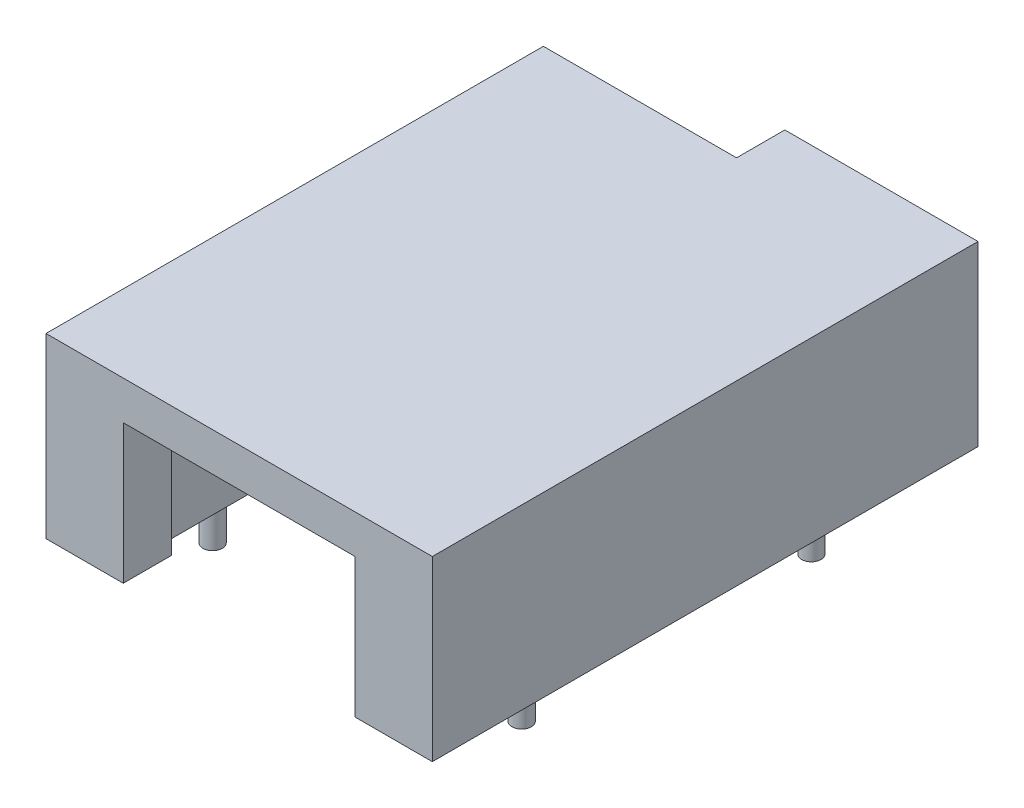
ISO-10303-21;
HEADER;
FILE_DESCRIPTION(('STEP AP214'),'2;1');
FILE_NAME('part.step','',(''),(''),'','','');
FILE_SCHEMA(('AUTOMOTIVE_DESIGN { 1 0 10303 214 1 1 1 1 }'));
ENDSEC;
DATA;
#1=APPLICATION_CONTEXT('core data for automotive mechanical design processes');
#2=APPLICATION_PROTOCOL_DEFINITION('international standard','automotive_design',2000,#1);
#3=PRODUCT_CONTEXT('',#1,'mechanical');
#4=PRODUCT('Part','Part','',(#3));
#5=PRODUCT_RELATED_PRODUCT_CATEGORY('part','',(#4));
#6=PRODUCT_DEFINITION_FORMATION('','',#4);
#7=PRODUCT_DEFINITION_CONTEXT('part definition',#1,'design');
#8=PRODUCT_DEFINITION('design','',#6,#7);
#9=PRODUCT_DEFINITION_SHAPE('','',#8);
#10=(LENGTH_UNIT() NAMED_UNIT(*) SI_UNIT(.MILLI.,.METRE.));
#11=(NAMED_UNIT(*) PLANE_ANGLE_UNIT() SI_UNIT($,.RADIAN.));
#12=(NAMED_UNIT(*) SI_UNIT($,.STERADIAN.) SOLID_ANGLE_UNIT());
#13=UNCERTAINTY_MEASURE_WITH_UNIT(LENGTH_MEASURE(1.E-05),#10,'distance_accuracy_value','');
#14=(GEOMETRIC_REPRESENTATION_CONTEXT(3) GLOBAL_UNCERTAINTY_ASSIGNED_CONTEXT((#13)) GLOBAL_UNIT_ASSIGNED_CONTEXT((#10,
#11,#12)) REPRESENTATION_CONTEXT('',''));
#15=CARTESIAN_POINT('',(0.,0.,0.));
#16=DIRECTION('',(0.,0.,1.));
#17=DIRECTION('',(1.,0.,0.));
#18=AXIS2_PLACEMENT_3D('',#15,#16,#17);
#19=CARTESIAN_POINT('',(0.,0.,0.));
#20=DIRECTION('',(0.,0.,-1.));
#21=DIRECTION('',(-1.,0.,0.));
#22=AXIS2_PLACEMENT_3D('',#19,#20,#21);
#23=PLANE('',#22);
#24=DIRECTION('',(-1.,0.,0.));
#25=VECTOR('',#24,1.);
#26=CARTESIAN_POINT('',(0.,18.4,0.));
#27=LINE('',#26,#25);
#28=CARTESIAN_POINT('',(20.,18.4,0.));
#29=VERTEX_POINT('',#28);
#30=CARTESIAN_POINT('',(0.,18.4,0.));
#31=VERTEX_POINT('',#30);
#32=EDGE_CURVE('E255',#29,#31,#27,.T.);
#33=ORIENTED_EDGE('',*,*,#32,.F.);
#34=DIRECTION('',(0.,-1.,0.));
#35=VECTOR('',#34,1.);
#36=CARTESIAN_POINT('',(20.,0.,0.));
#37=LINE('',#36,#35);
#38=CARTESIAN_POINT('',(20.,14.4,0.));
#39=VERTEX_POINT('',#38);
#40=EDGE_CURVE('E151',#29,#39,#37,.T.);
#41=ORIENTED_EDGE('',*,*,#40,.T.);
#42=DIRECTION('',(-1.,0.,0.));
#43=VECTOR('',#42,1.);
#44=CARTESIAN_POINT('',(6.5,14.4,0.));
#45=LINE('',#44,#43);
#46=CARTESIAN_POINT('',(6.5,14.4,0.));
#47=VERTEX_POINT('',#46);
#48=EDGE_CURVE('E228',#39,#47,#45,.T.);
#49=ORIENTED_EDGE('',*,*,#48,.T.);
#50=DIRECTION('',(0.,-1.,0.));
#51=VECTOR('',#50,1.);
#52=CARTESIAN_POINT('',(6.5,0.,0.));
#53=LINE('',#52,#51);
#54=CARTESIAN_POINT('',(6.5,0.,0.));
#55=VERTEX_POINT('',#54);
#56=EDGE_CURVE('E223',#47,#55,#53,.T.);
#57=ORIENTED_EDGE('',*,*,#56,.T.);
#58=DIRECTION('',(1.,0.,0.));
#59=VECTOR('',#58,1.);
#60=CARTESIAN_POINT('',(0.,0.,0.));
#61=LINE('',#60,#59);
#62=CARTESIAN_POINT('',(0.,0.,0.));
#63=VERTEX_POINT('',#62);
#64=EDGE_CURVE('E252',#63,#55,#61,.T.);
#65=ORIENTED_EDGE('',*,*,#64,.F.);
#66=DIRECTION('',(0.,-1.,0.));
#67=VECTOR('',#66,1.);
#68=CARTESIAN_POINT('',(0.,0.,0.));
#69=LINE('',#68,#67);
#70=EDGE_CURVE('E249',#31,#63,#69,.T.);
#71=ORIENTED_EDGE('',*,*,#70,.F.);
#72=EDGE_LOOP('',(#33,#41,#49,#57,#65,#71));
#73=FACE_BOUND('',#72,.T.);
#74=ADVANCED_FACE('F39',(#73),#23,.T.);
#75=CARTESIAN_POINT('',(0.,0.,46.5));
#76=DIRECTION('',(0.,1.,0.));
#77=DIRECTION('',(0.,0.,1.));
#78=AXIS2_PLACEMENT_3D('',#75,#76,#77);
#79=PLANE('',#78);
#80=CARTESIAN_POINT('',(3.99999999999999,0.,8.25));
#81=DIRECTION('',(0.,1.,0.));
#82=DIRECTION('',(0.,0.,1.));
#83=AXIS2_PLACEMENT_3D('',#80,#81,#82);
#84=CIRCLE('',#83,0.999999999999998);
#85=CARTESIAN_POINT('',(3.99999999999999,0.,9.25));
#86=VERTEX_POINT('',#85);
#87=EDGE_CURVE('E47',#86,#86,#84,.F.);
#88=ORIENTED_EDGE('',*,*,#87,.F.);
#89=EDGE_LOOP('',(#88));
#90=FACE_BOUND('',#89,.T.);
#91=CARTESIAN_POINT('',(3.99999999999999,0.,38.25));
#92=DIRECTION('',(0.,1.,0.));
#93=DIRECTION('',(0.,0.,1.));
#94=AXIS2_PLACEMENT_3D('',#91,#92,#93);
#95=CIRCLE('',#94,0.999999999999998);
#96=CARTESIAN_POINT('',(3.99999999999999,0.,39.25));
#97=VERTEX_POINT('',#96);
#98=EDGE_CURVE('E269',#97,#97,#95,.F.);
#99=ORIENTED_EDGE('',*,*,#98,.F.);
#100=EDGE_LOOP('',(#99));
#101=FACE_BOUND('',#100,.T.);
#102=ORIENTED_EDGE('',*,*,#64,.T.);
#103=DIRECTION('',(0.,0.,1.));
#104=VECTOR('',#103,1.);
#105=CARTESIAN_POINT('',(6.5,0.,0.));
#106=LINE('',#105,#104);
#107=CARTESIAN_POINT('',(6.5,0.,46.5));
#108=VERTEX_POINT('',#107);
#109=EDGE_CURVE('E231',#55,#108,#106,.T.);
#110=ORIENTED_EDGE('',*,*,#109,.T.);
#111=DIRECTION('',(1.,0.,0.));
#112=VECTOR('',#111,1.);
#113=CARTESIAN_POINT('',(0.,0.,46.5));
#114=LINE('',#113,#112);
#115=CARTESIAN_POINT('',(8.,0.,46.5));
#116=VERTEX_POINT('',#115);
#117=EDGE_CURVE('E154',#108,#116,#114,.T.);
#118=ORIENTED_EDGE('',*,*,#117,.T.);
#119=DIRECTION('',(0.,0.,-1.));
#120=VECTOR('',#119,1.);
#121=CARTESIAN_POINT('',(8.,0.,51.5));
#122=LINE('',#121,#120);
#123=CARTESIAN_POINT('',(8.,0.,51.5));
#124=VERTEX_POINT('',#123);
#125=EDGE_CURVE('E220',#124,#116,#122,.T.);
#126=ORIENTED_EDGE('',*,*,#125,.F.);
#127=DIRECTION('',(1.,0.,0.));
#128=VECTOR('',#127,1.);
#129=CARTESIAN_POINT('',(0.,0.,51.5));
#130=LINE('',#129,#128);
#131=CARTESIAN_POINT('',(0.,0.,51.5));
#132=VERTEX_POINT('',#131);
#133=EDGE_CURVE('E185',#132,#124,#130,.T.);
#134=ORIENTED_EDGE('',*,*,#133,.F.);
#135=DIRECTION('',(0.,0.,-1.));
#136=VECTOR('',#135,1.);
#137=CARTESIAN_POINT('',(0.,0.,46.5));
#138=LINE('',#137,#136);
#139=EDGE_CURVE('E263',#132,#63,#138,.T.);
#140=ORIENTED_EDGE('',*,*,#139,.T.);
#141=EDGE_LOOP('',(#102,#110,#118,#126,#134,#140));
#142=FACE_BOUND('',#141,.T.);
#143=ADVANCED_FACE('F276',(#90,#101,#142),#79,.F.);
#144=CARTESIAN_POINT('',(0.,0.,46.5));
#145=DIRECTION('',(1.,0.,0.));
#146=DIRECTION('',(0.,0.,-1.));
#147=AXIS2_PLACEMENT_3D('',#144,#145,#146);
#148=PLANE('',#147);
#149=ORIENTED_EDGE('',*,*,#70,.T.);
#150=ORIENTED_EDGE('',*,*,#139,.F.);
#151=DIRECTION('',(0.,-1.,0.));
#152=VECTOR('',#151,1.);
#153=CARTESIAN_POINT('',(0.,0.,51.5));
#154=LINE('',#153,#152);
#155=CARTESIAN_POINT('',(0.,18.4,51.5));
#156=VERTEX_POINT('',#155);
#157=EDGE_CURVE('E182',#156,#132,#154,.T.);
#158=ORIENTED_EDGE('',*,*,#157,.F.);
#159=DIRECTION('',(0.,0.,-1.));
#160=VECTOR('',#159,1.);
#161=CARTESIAN_POINT('',(0.,18.4,46.5));
#162=LINE('',#161,#160);
#163=EDGE_CURVE('E257',#156,#31,#162,.T.);
#164=ORIENTED_EDGE('',*,*,#163,.T.);
#165=EDGE_LOOP('',(#149,#150,#158,#164));
#166=FACE_BOUND('',#165,.T.);
#167=ADVANCED_FACE('F41',(#166),#148,.F.);
#168=CARTESIAN_POINT('',(36.,0.,8.25));
#169=DIRECTION('',(0.,1.,0.));
#170=DIRECTION('',(0.,0.,1.));
#171=AXIS2_PLACEMENT_3D('',#168,#169,#170);
#172=CIRCLE('',#171,0.999999999999998);
#173=CARTESIAN_POINT('',(36.,0.,9.25));
#174=VERTEX_POINT('',#173);
#175=EDGE_CURVE('E11',#174,#174,#172,.F.);
#176=ORIENTED_EDGE('',*,*,#175,.F.);
#177=EDGE_LOOP('',(#176));
#178=FACE_BOUND('',#177,.T.);
#179=CARTESIAN_POINT('',(36.,0.,38.25));
#180=DIRECTION('',(0.,1.,0.));
#181=DIRECTION('',(0.,0.,1.));
#182=AXIS2_PLACEMENT_3D('',#179,#180,#181);
#183=CIRCLE('',#182,0.999999999999998);
#184=CARTESIAN_POINT('',(36.,0.,39.25));
#185=VERTEX_POINT('',#184);
#186=EDGE_CURVE('E266',#185,#185,#183,.F.);
#187=ORIENTED_EDGE('',*,*,#186,.F.);
#188=EDGE_LOOP('',(#187));
#189=FACE_BOUND('',#188,.T.);
#190=DIRECTION('',(0.,0.,-1.));
#191=VECTOR('',#190,1.);
#192=CARTESIAN_POINT('',(40.,0.,46.5));
#193=LINE('',#192,#191);
#194=CARTESIAN_POINT('',(40.,0.,51.5));
#195=VERTEX_POINT('',#194);
#196=CARTESIAN_POINT('',(40.,0.,-5.));
#197=VERTEX_POINT('',#196);
#198=EDGE_CURVE('E261',#195,#197,#193,.T.);
#199=ORIENTED_EDGE('',*,*,#198,.F.);
#200=DIRECTION('',(1.,0.,0.));
#201=VECTOR('',#200,1.);
#202=CARTESIAN_POINT('',(0.,0.,51.5));
#203=LINE('',#202,#201);
#204=CARTESIAN_POINT('',(32.,1.09728353203603E-13,51.5));
#205=VERTEX_POINT('',#204);
#206=EDGE_CURVE('E195',#205,#195,#203,.T.);
#207=ORIENTED_EDGE('',*,*,#206,.F.);
#208=DIRECTION('',(0.,0.,-1.));
#209=VECTOR('',#208,1.);
#210=CARTESIAN_POINT('',(32.,1.09728353203603E-13,51.5));
#211=LINE('',#210,#209);
#212=CARTESIAN_POINT('',(32.,1.09728353203603E-13,46.5));
#213=VERTEX_POINT('',#212);
#214=EDGE_CURVE('E204',#205,#213,#211,.T.);
#215=ORIENTED_EDGE('',*,*,#214,.T.);
#216=DIRECTION('',(1.,0.,0.));
#217=VECTOR('',#216,1.);
#218=CARTESIAN_POINT('',(0.,0.,46.5));
#219=LINE('',#218,#217);
#220=CARTESIAN_POINT('',(33.5,0.,46.5));
#221=VERTEX_POINT('',#220);
#222=EDGE_CURVE('E186',#213,#221,#219,.T.);
#223=ORIENTED_EDGE('',*,*,#222,.T.);
#224=DIRECTION('',(0.,0.,1.));
#225=VECTOR('',#224,1.);
#226=CARTESIAN_POINT('',(33.5,0.,0.));
#227=LINE('',#226,#225);
#228=CARTESIAN_POINT('',(33.5,0.,0.));
#229=VERTEX_POINT('',#228);
#230=EDGE_CURVE('E238',#229,#221,#227,.T.);
#231=ORIENTED_EDGE('',*,*,#230,.F.);
#232=DIRECTION('',(-1.,0.,0.));
#233=VECTOR('',#232,1.);
#234=CARTESIAN_POINT('',(0.,0.,0.));
#235=LINE('',#234,#233);
#236=CARTESIAN_POINT('',(20.,0.,0.));
#237=VERTEX_POINT('',#236);
#238=EDGE_CURVE('E171',#229,#237,#235,.T.);
#239=ORIENTED_EDGE('',*,*,#238,.T.);
#240=DIRECTION('',(0.,0.,1.));
#241=VECTOR('',#240,1.);
#242=CARTESIAN_POINT('',(20.,0.,-5.));
#243=LINE('',#242,#241);
#244=CARTESIAN_POINT('',(20.,0.,-5.));
#245=VERTEX_POINT('',#244);
#246=EDGE_CURVE('E155',#245,#237,#243,.T.);
#247=ORIENTED_EDGE('',*,*,#246,.F.);
#248=DIRECTION('',(-1.,0.,0.));
#249=VECTOR('',#248,1.);
#250=CARTESIAN_POINT('',(0.,0.,-5.));
#251=LINE('',#250,#249);
#252=EDGE_CURVE('E169',#197,#245,#251,.T.);
#253=ORIENTED_EDGE('',*,*,#252,.F.);
#254=EDGE_LOOP('',(#199,#207,#215,#223,#231,#239,#247,#253));
#255=FACE_BOUND('',#254,.T.);
#256=ADVANCED_FACE('F279',(#178,#189,#255),#79,.F.);
#257=CARTESIAN_POINT('',(40.,0.,46.5));
#258=DIRECTION('',(-1.,0.,0.));
#259=DIRECTION('',(0.,0.,1.));
#260=AXIS2_PLACEMENT_3D('',#257,#258,#259);
#261=PLANE('',#260);
#262=ORIENTED_EDGE('',*,*,#198,.T.);
#263=DIRECTION('',(0.,-1.,0.));
#264=VECTOR('',#263,1.);
#265=CARTESIAN_POINT('',(40.,0.,-5.));
#266=LINE('',#265,#264);
#267=CARTESIAN_POINT('',(40.,18.4,-5.));
#268=VERTEX_POINT('',#267);
#269=EDGE_CURVE('E165',#268,#197,#266,.T.);
#270=ORIENTED_EDGE('',*,*,#269,.F.);
#271=DIRECTION('',(0.,0.,-1.));
#272=VECTOR('',#271,1.);
#273=CARTESIAN_POINT('',(40.,18.4,46.5));
#274=LINE('',#273,#272);
#275=CARTESIAN_POINT('',(40.,18.4,51.5));
#276=VERTEX_POINT('',#275);
#277=EDGE_CURVE('E161',#276,#268,#274,.T.);
#278=ORIENTED_EDGE('',*,*,#277,.F.);
#279=DIRECTION('',(0.,1.,0.));
#280=VECTOR('',#279,1.);
#281=CARTESIAN_POINT('',(40.,0.,51.5));
#282=LINE('',#281,#280);
#283=EDGE_CURVE('E198',#195,#276,#282,.T.);
#284=ORIENTED_EDGE('',*,*,#283,.F.);
#285=EDGE_LOOP('',(#262,#270,#278,#284));
#286=FACE_BOUND('',#285,.T.);
#287=ADVANCED_FACE('F315',(#286),#261,.F.);
#288=CARTESIAN_POINT('',(0.,18.4,46.5));
#289=DIRECTION('',(0.,-1.,0.));
#290=DIRECTION('',(0.,0.,-1.));
#291=AXIS2_PLACEMENT_3D('',#288,#289,#290);
#292=PLANE('',#291);
#293=ORIENTED_EDGE('',*,*,#277,.T.);
#294=DIRECTION('',(1.,0.,0.));
#295=VECTOR('',#294,1.);
#296=CARTESIAN_POINT('',(0.,18.4,-5.));
#297=LINE('',#296,#295);
#298=CARTESIAN_POINT('',(20.,18.4,-5.));
#299=VERTEX_POINT('',#298);
#300=EDGE_CURVE('E158',#299,#268,#297,.T.);
#301=ORIENTED_EDGE('',*,*,#300,.F.);
#302=DIRECTION('',(0.,0.,1.));
#303=VECTOR('',#302,1.);
#304=CARTESIAN_POINT('',(20.,18.4,-5.));
#305=LINE('',#304,#303);
#306=EDGE_CURVE('E145',#299,#29,#305,.T.);
#307=ORIENTED_EDGE('',*,*,#306,.T.);
#308=ORIENTED_EDGE('',*,*,#32,.T.);
#309=ORIENTED_EDGE('',*,*,#163,.F.);
#310=DIRECTION('',(-1.,0.,0.));
#311=VECTOR('',#310,1.);
#312=CARTESIAN_POINT('',(0.,18.4,51.5));
#313=LINE('',#312,#311);
#314=EDGE_CURVE('E201',#276,#156,#313,.T.);
#315=ORIENTED_EDGE('',*,*,#314,.F.);
#316=EDGE_LOOP('',(#293,#301,#307,#308,#309,#315));
#317=FACE_BOUND('',#316,.T.);
#318=ADVANCED_FACE('F159',(#317),#292,.F.);
#319=CARTESIAN_POINT('',(6.5,0.,0.));
#320=DIRECTION('',(-1.,0.,0.));
#321=DIRECTION('',(0.,0.,1.));
#322=AXIS2_PLACEMENT_3D('',#319,#320,#321);
#323=PLANE('',#322);
#324=ORIENTED_EDGE('',*,*,#109,.F.);
#325=ORIENTED_EDGE('',*,*,#56,.F.);
#326=DIRECTION('',(0.,0.,1.));
#327=VECTOR('',#326,1.);
#328=CARTESIAN_POINT('',(6.5,14.4,0.));
#329=LINE('',#328,#327);
#330=CARTESIAN_POINT('',(6.5,14.4,46.5));
#331=VERTEX_POINT('',#330);
#332=EDGE_CURVE('E232',#47,#331,#329,.T.);
#333=ORIENTED_EDGE('',*,*,#332,.T.);
#334=DIRECTION('',(0.,1.,0.));
#335=VECTOR('',#334,1.);
#336=CARTESIAN_POINT('',(6.5,0.,46.5));
#337=LINE('',#336,#335);
#338=EDGE_CURVE('E246',#108,#331,#337,.T.);
#339=ORIENTED_EDGE('',*,*,#338,.F.);
#340=EDGE_LOOP('',(#324,#325,#333,#339));
#341=FACE_BOUND('',#340,.T.);
#342=ADVANCED_FACE('F290',(#341),#323,.F.);
#343=CARTESIAN_POINT('',(6.5,14.4,0.));
#344=DIRECTION('',(0.,1.,0.));
#345=DIRECTION('',(-1.,0.,0.));
#346=AXIS2_PLACEMENT_3D('',#343,#344,#345);
#347=PLANE('',#346);
#348=ORIENTED_EDGE('',*,*,#332,.F.);
#349=ORIENTED_EDGE('',*,*,#48,.F.);
#350=CARTESIAN_POINT('',(33.5,14.4,0.));
#351=VERTEX_POINT('',#350);
#352=EDGE_CURVE('E229',#351,#39,#45,.T.);
#353=ORIENTED_EDGE('',*,*,#352,.F.);
#354=DIRECTION('',(0.,0.,1.));
#355=VECTOR('',#354,1.);
#356=CARTESIAN_POINT('',(33.5,14.4,0.));
#357=LINE('',#356,#355);
#358=CARTESIAN_POINT('',(33.5,14.4,46.5));
#359=VERTEX_POINT('',#358);
#360=EDGE_CURVE('E236',#351,#359,#357,.T.);
#361=ORIENTED_EDGE('',*,*,#360,.T.);
#362=DIRECTION('',(1.,0.,0.));
#363=VECTOR('',#362,1.);
#364=CARTESIAN_POINT('',(0.,14.4,46.5));
#365=LINE('',#364,#363);
#366=CARTESIAN_POINT('',(32.,14.4,46.5));
#367=VERTEX_POINT('',#366);
#368=EDGE_CURVE('E62',#367,#359,#365,.T.);
#369=ORIENTED_EDGE('',*,*,#368,.F.);
#370=DIRECTION('',(0.,0.,-1.));
#371=VECTOR('',#370,1.);
#372=CARTESIAN_POINT('',(32.,14.4,51.5));
#373=LINE('',#372,#371);
#374=CARTESIAN_POINT('',(32.,14.4,51.5));
#375=VERTEX_POINT('',#374);
#376=EDGE_CURVE('E215',#375,#367,#373,.T.);
#377=ORIENTED_EDGE('',*,*,#376,.F.);
#378=DIRECTION('',(1.,0.,0.));
#379=VECTOR('',#378,1.);
#380=CARTESIAN_POINT('',(0.,14.4,51.5));
#381=LINE('',#380,#379);
#382=CARTESIAN_POINT('',(8.,14.4,51.5));
#383=VERTEX_POINT('',#382);
#384=EDGE_CURVE('E190',#383,#375,#381,.T.);
#385=ORIENTED_EDGE('',*,*,#384,.F.);
#386=DIRECTION('',(0.,0.,-1.));
#387=VECTOR('',#386,1.);
#388=CARTESIAN_POINT('',(8.,14.4,51.5));
#389=LINE('',#388,#387);
#390=CARTESIAN_POINT('',(8.,14.4,46.5));
#391=VERTEX_POINT('',#390);
#392=EDGE_CURVE('E217',#383,#391,#389,.T.);
#393=ORIENTED_EDGE('',*,*,#392,.T.);
#394=EDGE_CURVE('E244',#331,#391,#365,.T.);
#395=ORIENTED_EDGE('',*,*,#394,.F.);
#396=EDGE_LOOP('',(#348,#349,#353,#361,#369,#377,#385,#393,#395));
#397=FACE_BOUND('',#396,.T.);
#398=ADVANCED_FACE('F306',(#397),#347,.F.);
#399=CARTESIAN_POINT('',(33.5,0.,0.));
#400=DIRECTION('',(1.,0.,0.));
#401=DIRECTION('',(0.,1.,0.));
#402=AXIS2_PLACEMENT_3D('',#399,#400,#401);
#403=PLANE('',#402);
#404=ORIENTED_EDGE('',*,*,#360,.F.);
#405=DIRECTION('',(0.,1.,0.));
#406=VECTOR('',#405,1.);
#407=CARTESIAN_POINT('',(33.5,0.,0.));
#408=LINE('',#407,#406);
#409=EDGE_CURVE('E226',#229,#351,#408,.T.);
#410=ORIENTED_EDGE('',*,*,#409,.F.);
#411=ORIENTED_EDGE('',*,*,#230,.T.);
#412=DIRECTION('',(0.,-1.,0.));
#413=VECTOR('',#412,1.);
#414=CARTESIAN_POINT('',(33.5,0.,46.5));
#415=LINE('',#414,#413);
#416=EDGE_CURVE('E235',#359,#221,#415,.T.);
#417=ORIENTED_EDGE('',*,*,#416,.F.);
#418=EDGE_LOOP('',(#404,#410,#411,#417));
#419=FACE_BOUND('',#418,.T.);
#420=ADVANCED_FACE('F394',(#419),#403,.F.);
#421=CARTESIAN_POINT('',(0.,0.,46.5));
#422=DIRECTION('',(0.,0.,1.));
#423=DIRECTION('',(1.,0.,0.));
#424=AXIS2_PLACEMENT_3D('',#421,#422,#423);
#425=PLANE('',#424);
#426=ORIENTED_EDGE('',*,*,#117,.F.);
#427=ORIENTED_EDGE('',*,*,#338,.T.);
#428=ORIENTED_EDGE('',*,*,#394,.T.);
#429=DIRECTION('',(0.,1.,0.));
#430=VECTOR('',#429,1.);
#431=CARTESIAN_POINT('',(8.,0.,46.5));
#432=LINE('',#431,#430);
#433=EDGE_CURVE('E206',#116,#391,#432,.T.);
#434=ORIENTED_EDGE('',*,*,#433,.F.);
#435=EDGE_LOOP('',(#426,#427,#428,#434));
#436=FACE_BOUND('',#435,.T.);
#437=ADVANCED_FACE('F292',(#436),#425,.F.);
#438=DIRECTION('',(0.,1.,0.));
#439=VECTOR('',#438,1.);
#440=CARTESIAN_POINT('',(32.,0.,46.5));
#441=LINE('',#440,#439);
#442=EDGE_CURVE('E209',#213,#367,#441,.T.);
#443=ORIENTED_EDGE('',*,*,#442,.T.);
#444=ORIENTED_EDGE('',*,*,#368,.T.);
#445=ORIENTED_EDGE('',*,*,#416,.T.);
#446=ORIENTED_EDGE('',*,*,#222,.F.);
#447=EDGE_LOOP('',(#443,#444,#445,#446));
#448=FACE_BOUND('',#447,.T.);
#449=ADVANCED_FACE('F407',(#448),#425,.F.);
#450=CARTESIAN_POINT('',(8.,0.,51.5));
#451=DIRECTION('',(-1.,0.,0.));
#452=DIRECTION('',(0.,0.,1.));
#453=AXIS2_PLACEMENT_3D('',#450,#451,#452);
#454=PLANE('',#453);
#455=ORIENTED_EDGE('',*,*,#433,.T.);
#456=ORIENTED_EDGE('',*,*,#392,.F.);
#457=DIRECTION('',(0.,1.,0.));
#458=VECTOR('',#457,1.);
#459=CARTESIAN_POINT('',(8.,0.,51.5));
#460=LINE('',#459,#458);
#461=EDGE_CURVE('E188',#124,#383,#460,.T.);
#462=ORIENTED_EDGE('',*,*,#461,.F.);
#463=ORIENTED_EDGE('',*,*,#125,.T.);
#464=EDGE_LOOP('',(#455,#456,#462,#463));
#465=FACE_BOUND('',#464,.T.);
#466=ADVANCED_FACE('F297',(#465),#454,.F.);
#467=CARTESIAN_POINT('',(32.,0.,51.5));
#468=DIRECTION('',(-1.,0.,0.));
#469=DIRECTION('',(0.,0.,1.));
#470=AXIS2_PLACEMENT_3D('',#467,#468,#469);
#471=PLANE('',#470);
#472=ORIENTED_EDGE('',*,*,#442,.F.);
#473=ORIENTED_EDGE('',*,*,#214,.F.);
#474=DIRECTION('',(0.,1.,0.));
#475=VECTOR('',#474,1.);
#476=CARTESIAN_POINT('',(32.,0.,51.5));
#477=LINE('',#476,#475);
#478=EDGE_CURVE('E192',#205,#375,#477,.T.);
#479=ORIENTED_EDGE('',*,*,#478,.T.);
#480=ORIENTED_EDGE('',*,*,#376,.T.);
#481=EDGE_LOOP('',(#472,#473,#479,#480));
#482=FACE_BOUND('',#481,.T.);
#483=ADVANCED_FACE('F310',(#482),#471,.T.);
#484=CARTESIAN_POINT('',(0.,0.,51.5));
#485=DIRECTION('',(0.,0.,1.));
#486=DIRECTION('',(1.,0.,0.));
#487=AXIS2_PLACEMENT_3D('',#484,#485,#486);
#488=PLANE('',#487);
#489=ORIENTED_EDGE('',*,*,#157,.T.);
#490=ORIENTED_EDGE('',*,*,#133,.T.);
#491=ORIENTED_EDGE('',*,*,#461,.T.);
#492=ORIENTED_EDGE('',*,*,#384,.T.);
#493=ORIENTED_EDGE('',*,*,#478,.F.);
#494=ORIENTED_EDGE('',*,*,#206,.T.);
#495=ORIENTED_EDGE('',*,*,#283,.T.);
#496=ORIENTED_EDGE('',*,*,#314,.T.);
#497=EDGE_LOOP('',(#489,#490,#491,#492,#493,#494,#495,#496));
#498=FACE_BOUND('',#497,.T.);
#499=ADVANCED_FACE('F301',(#498),#488,.T.);
#500=CARTESIAN_POINT('',(0.,0.,0.));
#501=DIRECTION('',(0.,0.,-1.));
#502=DIRECTION('',(-1.,0.,0.));
#503=AXIS2_PLACEMENT_3D('',#500,#501,#502);
#504=PLANE('',#503);
#505=ORIENTED_EDGE('',*,*,#238,.F.);
#506=ORIENTED_EDGE('',*,*,#409,.T.);
#507=ORIENTED_EDGE('',*,*,#352,.T.);
#508=EDGE_CURVE('E54',#39,#237,#37,.T.);
#509=ORIENTED_EDGE('',*,*,#508,.T.);
#510=EDGE_LOOP('',(#505,#506,#507,#509));
#511=FACE_BOUND('',#510,.T.);
#512=ADVANCED_FACE('F319',(#511),#504,.F.);
#513=CARTESIAN_POINT('',(20.,0.,-5.));
#514=DIRECTION('',(-1.,0.,0.));
#515=DIRECTION('',(0.,-1.,0.));
#516=AXIS2_PLACEMENT_3D('',#513,#514,#515);
#517=PLANE('',#516);
#518=ORIENTED_EDGE('',*,*,#40,.F.);
#519=ORIENTED_EDGE('',*,*,#306,.F.);
#520=DIRECTION('',(0.,-1.,0.));
#521=VECTOR('',#520,1.);
#522=CARTESIAN_POINT('',(20.,0.,-5.));
#523=LINE('',#522,#521);
#524=EDGE_CURVE('E149',#299,#245,#523,.T.);
#525=ORIENTED_EDGE('',*,*,#524,.T.);
#526=ORIENTED_EDGE('',*,*,#246,.T.);
#527=ORIENTED_EDGE('',*,*,#508,.F.);
#528=EDGE_LOOP('',(#518,#519,#525,#526,#527));
#529=FACE_BOUND('',#528,.T.);
#530=ADVANCED_FACE('F147',(#529),#517,.T.);
#531=CARTESIAN_POINT('',(0.,0.,-5.));
#532=DIRECTION('',(0.,0.,-1.));
#533=DIRECTION('',(-1.,0.,0.));
#534=AXIS2_PLACEMENT_3D('',#531,#532,#533);
#535=PLANE('',#534);
#536=ORIENTED_EDGE('',*,*,#524,.F.);
#537=ORIENTED_EDGE('',*,*,#300,.T.);
#538=ORIENTED_EDGE('',*,*,#269,.T.);
#539=ORIENTED_EDGE('',*,*,#252,.T.);
#540=EDGE_LOOP('',(#536,#537,#538,#539));
#541=FACE_BOUND('',#540,.T.);
#542=ADVANCED_FACE('F167',(#541),#535,.T.);
#543=CARTESIAN_POINT('',(36.,-5.,38.25));
#544=DIRECTION('',(0.,1.,0.));
#545=DIRECTION('',(0.,0.,1.));
#546=AXIS2_PLACEMENT_3D('',#543,#544,#545);
#547=CYLINDRICAL_SURFACE('',#546,0.999999999999998);
#548=CARTESIAN_POINT('',(36.,-5.,38.25));
#549=DIRECTION('',(0.,-1.,0.));
#550=DIRECTION('',(0.,0.,-1.));
#551=AXIS2_PLACEMENT_3D('',#548,#549,#550);
#552=CIRCLE('',#551,0.999999999999998);
#553=CARTESIAN_POINT('',(36.,-5.,37.25));
#554=VERTEX_POINT('',#553);
#555=EDGE_CURVE('E175',#554,#554,#552,.T.);
#556=ORIENTED_EDGE('',*,*,#555,.F.);
#557=EDGE_LOOP('',(#556));
#558=FACE_BOUND('',#557,.T.);
#559=ORIENTED_EDGE('',*,*,#186,.T.);
#560=EDGE_LOOP('',(#559));
#561=FACE_BOUND('',#560,.T.);
#562=ADVANCED_FACE('F348',(#558,#561),#547,.T.);
#563=CARTESIAN_POINT('',(36.,-5.,38.25));
#564=DIRECTION('',(0.,-1.,0.));
#565=DIRECTION('',(0.,0.,-1.));
#566=AXIS2_PLACEMENT_3D('',#563,#564,#565);
#567=PLANE('',#566);
#568=ORIENTED_EDGE('',*,*,#555,.T.);
#569=EDGE_LOOP('',(#568));
#570=FACE_BOUND('',#569,.T.);
#571=ADVANCED_FACE('F350',(#570),#567,.T.);
#572=CARTESIAN_POINT('',(3.99999999999999,-5.,38.25));
#573=DIRECTION('',(0.,1.,0.));
#574=DIRECTION('',(0.,0.,1.));
#575=AXIS2_PLACEMENT_3D('',#572,#573,#574);
#576=CYLINDRICAL_SURFACE('',#575,0.999999999999998);
#577=CARTESIAN_POINT('',(3.99999999999999,-5.,38.25));
#578=DIRECTION('',(0.,-1.,0.));
#579=DIRECTION('',(0.,0.,1.));
#580=AXIS2_PLACEMENT_3D('',#577,#578,#579);
#581=CIRCLE('',#580,0.999999999999998);
#582=CARTESIAN_POINT('',(3.99999999999999,-5.,39.25));
#583=VERTEX_POINT('',#582);
#584=EDGE_CURVE('E321',#583,#583,#581,.T.);
#585=ORIENTED_EDGE('',*,*,#584,.F.);
#586=EDGE_LOOP('',(#585));
#587=FACE_BOUND('',#586,.T.);
#588=ORIENTED_EDGE('',*,*,#98,.T.);
#589=EDGE_LOOP('',(#588));
#590=FACE_BOUND('',#589,.T.);
#591=ADVANCED_FACE('F357',(#587,#590),#576,.T.);
#592=CARTESIAN_POINT('',(3.99999999999999,-5.,38.25));
#593=DIRECTION('',(0.,1.,0.));
#594=DIRECTION('',(0.,0.,1.));
#595=AXIS2_PLACEMENT_3D('',#592,#593,#594);
#596=PLANE('',#595);
#597=ORIENTED_EDGE('',*,*,#584,.T.);
#598=EDGE_LOOP('',(#597));
#599=FACE_BOUND('',#598,.T.);
#600=ADVANCED_FACE('F471',(#599),#596,.F.);
#601=CARTESIAN_POINT('',(3.99999999999999,-5.,8.25));
#602=DIRECTION('',(0.,1.,0.));
#603=DIRECTION('',(0.,0.,1.));
#604=AXIS2_PLACEMENT_3D('',#601,#602,#603);
#605=CYLINDRICAL_SURFACE('',#604,0.999999999999998);
#606=CARTESIAN_POINT('',(3.99999999999999,-5.,8.25));
#607=DIRECTION('',(0.,-1.,0.));
#608=DIRECTION('',(0.,0.,-1.));
#609=AXIS2_PLACEMENT_3D('',#606,#607,#608);
#610=CIRCLE('',#609,0.999999999999998);
#611=CARTESIAN_POINT('',(3.99999999999999,-5.,7.25));
#612=VERTEX_POINT('',#611);
#613=EDGE_CURVE('E325',#612,#612,#610,.T.);
#614=ORIENTED_EDGE('',*,*,#613,.F.);
#615=EDGE_LOOP('',(#614));
#616=FACE_BOUND('',#615,.T.);
#617=ORIENTED_EDGE('',*,*,#87,.T.);
#618=EDGE_LOOP('',(#617));
#619=FACE_BOUND('',#618,.T.);
#620=ADVANCED_FACE('F274',(#616,#619),#605,.T.);
#621=CARTESIAN_POINT('',(3.99999999999999,-5.,8.25));
#622=DIRECTION('',(0.,-1.,0.));
#623=DIRECTION('',(0.,0.,-1.));
#624=AXIS2_PLACEMENT_3D('',#621,#622,#623);
#625=PLANE('',#624);
#626=ORIENTED_EDGE('',*,*,#613,.T.);
#627=EDGE_LOOP('',(#626));
#628=FACE_BOUND('',#627,.T.);
#629=ADVANCED_FACE('F340',(#628),#625,.T.);
#630=CARTESIAN_POINT('',(36.,-5.,8.25));
#631=DIRECTION('',(0.,1.,0.));
#632=DIRECTION('',(0.,0.,1.));
#633=AXIS2_PLACEMENT_3D('',#630,#631,#632);
#634=CYLINDRICAL_SURFACE('',#633,0.999999999999998);
#635=CARTESIAN_POINT('',(36.,-5.,8.25));
#636=DIRECTION('',(0.,-1.,0.));
#637=DIRECTION('',(0.,0.,1.));
#638=AXIS2_PLACEMENT_3D('',#635,#636,#637);
#639=CIRCLE('',#638,0.999999999999998);
#640=CARTESIAN_POINT('',(36.,-5.,9.25));
#641=VERTEX_POINT('',#640);
#642=EDGE_CURVE('E329',#641,#641,#639,.T.);
#643=ORIENTED_EDGE('',*,*,#642,.F.);
#644=EDGE_LOOP('',(#643));
#645=FACE_BOUND('',#644,.T.);
#646=ORIENTED_EDGE('',*,*,#175,.T.);
#647=EDGE_LOOP('',(#646));
#648=FACE_BOUND('',#647,.T.);
#649=ADVANCED_FACE('F337',(#645,#648),#634,.T.);
#650=CARTESIAN_POINT('',(36.,-5.,8.25));
#651=DIRECTION('',(0.,1.,0.));
#652=DIRECTION('',(0.,0.,1.));
#653=AXIS2_PLACEMENT_3D('',#650,#651,#652);
#654=PLANE('',#653);
#655=ORIENTED_EDGE('',*,*,#642,.T.);
#656=EDGE_LOOP('',(#655));
#657=FACE_BOUND('',#656,.T.);
#658=ADVANCED_FACE('F335',(#657),#654,.F.);
#659=CLOSED_SHELL('',(#74,#143,#167,#256,#287,#318,#342,#398,#420,#437,#449,#466,#483,#499,#512,
#530,#542,#562,#571,#591,#600,#620,#629,#649,#658));
#660=MANIFOLD_SOLID_BREP('B2',#659);
#661=ADVANCED_BREP_SHAPE_REPRESENTATION('',(#18,#660),#14);
#662=SHAPE_DEFINITION_REPRESENTATION(#9,#661);
ENDSEC;
END-ISO-10303-21;
